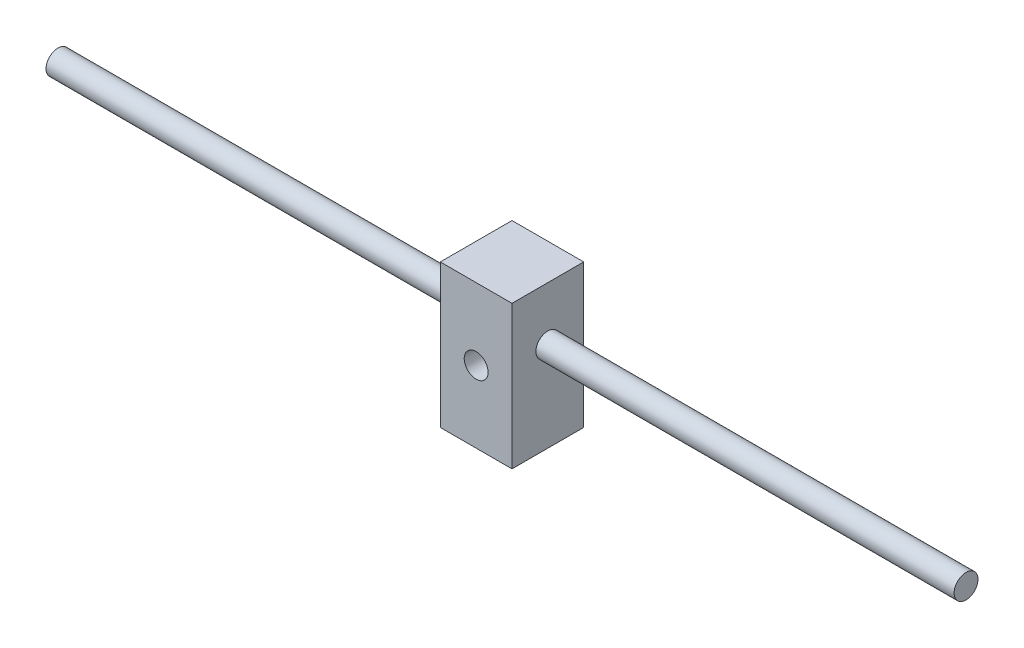
ISO-10303-21;
HEADER;
FILE_DESCRIPTION(('STEP AP214'),'2;1');
FILE_NAME('part.step','',(''),(''),'','','');
FILE_SCHEMA(('AUTOMOTIVE_DESIGN { 1 0 10303 214 1 1 1 1 }'));
ENDSEC;
DATA;
#1=APPLICATION_CONTEXT('core data for automotive mechanical design processes');
#2=APPLICATION_PROTOCOL_DEFINITION('international standard','automotive_design',2000,#1);
#3=PRODUCT_CONTEXT('',#1,'mechanical');
#4=PRODUCT('Part','Part','',(#3));
#5=PRODUCT_RELATED_PRODUCT_CATEGORY('part','',(#4));
#6=PRODUCT_DEFINITION_FORMATION('','',#4);
#7=PRODUCT_DEFINITION_CONTEXT('part definition',#1,'design');
#8=PRODUCT_DEFINITION('design','',#6,#7);
#9=PRODUCT_DEFINITION_SHAPE('','',#8);
#10=(LENGTH_UNIT() NAMED_UNIT(*) SI_UNIT(.MILLI.,.METRE.));
#11=(NAMED_UNIT(*) PLANE_ANGLE_UNIT() SI_UNIT($,.RADIAN.));
#12=(NAMED_UNIT(*) SI_UNIT($,.STERADIAN.) SOLID_ANGLE_UNIT());
#13=UNCERTAINTY_MEASURE_WITH_UNIT(LENGTH_MEASURE(1.E-05),#10,'distance_accuracy_value','');
#14=(GEOMETRIC_REPRESENTATION_CONTEXT(3) GLOBAL_UNCERTAINTY_ASSIGNED_CONTEXT((#13)) GLOBAL_UNIT_ASSIGNED_CONTEXT((#10,
#11,#12)) REPRESENTATION_CONTEXT('',''));
#15=CARTESIAN_POINT('',(0.,0.,0.));
#16=DIRECTION('',(0.,0.,1.));
#17=DIRECTION('',(1.,0.,0.));
#18=AXIS2_PLACEMENT_3D('',#15,#16,#17);
#19=CARTESIAN_POINT('',(0.,0.,30.));
#20=DIRECTION('',(0.,0.,1.));
#21=DIRECTION('',(1.,0.,0.));
#22=AXIS2_PLACEMENT_3D('',#19,#20,#21);
#23=PLANE('',#22);
#24=DIRECTION('',(0.,-1.,0.));
#25=VECTOR('',#24,1.);
#26=CARTESIAN_POINT('',(-30.,60.,30.));
#27=LINE('',#26,#25);
#28=CARTESIAN_POINT('',(-30.,60.,30.));
#29=VERTEX_POINT('',#28);
#30=CARTESIAN_POINT('',(-30.,-60.,30.));
#31=VERTEX_POINT('',#30);
#32=EDGE_CURVE('E95',#29,#31,#27,.T.);
#33=ORIENTED_EDGE('',*,*,#32,.T.);
#34=DIRECTION('',(1.,0.,0.));
#35=VECTOR('',#34,1.);
#36=CARTESIAN_POINT('',(-30.,-60.,30.));
#37=LINE('',#36,#35);
#38=CARTESIAN_POINT('',(30.,-60.,30.));
#39=VERTEX_POINT('',#38);
#40=EDGE_CURVE('E90',#31,#39,#37,.T.);
#41=ORIENTED_EDGE('',*,*,#40,.T.);
#42=DIRECTION('',(0.,1.,0.));
#43=VECTOR('',#42,1.);
#44=CARTESIAN_POINT('',(30.,60.,30.));
#45=LINE('',#44,#43);
#46=CARTESIAN_POINT('',(30.,60.,30.));
#47=VERTEX_POINT('',#46);
#48=EDGE_CURVE('E93',#39,#47,#45,.T.);
#49=ORIENTED_EDGE('',*,*,#48,.T.);
#50=DIRECTION('',(-1.,0.,0.));
#51=VECTOR('',#50,1.);
#52=CARTESIAN_POINT('',(-30.,60.,30.));
#53=LINE('',#52,#51);
#54=EDGE_CURVE('E59',#47,#29,#53,.T.);
#55=ORIENTED_EDGE('',*,*,#54,.T.);
#56=EDGE_LOOP('',(#33,#41,#49,#55));
#57=FACE_BOUND('',#56,.T.);
#58=CARTESIAN_POINT('',(0.,0.,30.));
#59=DIRECTION('',(0.,0.,1.));
#60=DIRECTION('',(1.,0.,0.));
#61=AXIS2_PLACEMENT_3D('',#58,#59,#60);
#62=CIRCLE('',#61,10.);
#63=CARTESIAN_POINT('',(-10.,0.,30.));
#64=VERTEX_POINT('',#63);
#65=EDGE_CURVE('E116',#64,#64,#62,.T.);
#66=ORIENTED_EDGE('',*,*,#65,.F.);
#67=EDGE_LOOP('',(#66));
#68=FACE_BOUND('',#67,.T.);
#69=ADVANCED_FACE('F39',(#57,#68),#23,.T.);
#70=CARTESIAN_POINT('',(0.,0.,-30.));
#71=DIRECTION('',(0.,0.,1.));
#72=DIRECTION('',(1.,0.,0.));
#73=AXIS2_PLACEMENT_3D('',#70,#71,#72);
#74=PLANE('',#73);
#75=DIRECTION('',(0.,-1.,0.));
#76=VECTOR('',#75,1.);
#77=CARTESIAN_POINT('',(-30.,60.,-30.));
#78=LINE('',#77,#76);
#79=CARTESIAN_POINT('',(-30.,60.,-30.));
#80=VERTEX_POINT('',#79);
#81=CARTESIAN_POINT('',(-30.,-60.,-30.));
#82=VERTEX_POINT('',#81);
#83=EDGE_CURVE('E112',#80,#82,#78,.T.);
#84=ORIENTED_EDGE('',*,*,#83,.F.);
#85=DIRECTION('',(-1.,0.,0.));
#86=VECTOR('',#85,1.);
#87=CARTESIAN_POINT('',(-30.,60.,-30.));
#88=LINE('',#87,#86);
#89=CARTESIAN_POINT('',(30.,60.,-30.));
#90=VERTEX_POINT('',#89);
#91=EDGE_CURVE('E82',#90,#80,#88,.T.);
#92=ORIENTED_EDGE('',*,*,#91,.F.);
#93=DIRECTION('',(0.,1.,0.));
#94=VECTOR('',#93,1.);
#95=CARTESIAN_POINT('',(30.,60.,-30.));
#96=LINE('',#95,#94);
#97=CARTESIAN_POINT('',(30.,-60.,-30.));
#98=VERTEX_POINT('',#97);
#99=EDGE_CURVE('E76',#98,#90,#96,.T.);
#100=ORIENTED_EDGE('',*,*,#99,.F.);
#101=DIRECTION('',(1.,0.,0.));
#102=VECTOR('',#101,1.);
#103=CARTESIAN_POINT('',(-30.,-60.,-30.));
#104=LINE('',#103,#102);
#105=EDGE_CURVE('E101',#82,#98,#104,.T.);
#106=ORIENTED_EDGE('',*,*,#105,.F.);
#107=EDGE_LOOP('',(#84,#92,#100,#106));
#108=FACE_BOUND('',#107,.T.);
#109=CARTESIAN_POINT('',(0.,0.,-30.));
#110=DIRECTION('',(0.,0.,1.));
#111=DIRECTION('',(1.,0.,0.));
#112=AXIS2_PLACEMENT_3D('',#109,#110,#111);
#113=CIRCLE('',#112,10.);
#114=CARTESIAN_POINT('',(-10.,0.,-30.));
#115=VERTEX_POINT('',#114);
#116=EDGE_CURVE('E134',#115,#115,#113,.T.);
#117=ORIENTED_EDGE('',*,*,#116,.T.);
#118=EDGE_LOOP('',(#117));
#119=FACE_BOUND('',#118,.T.);
#120=ADVANCED_FACE('F129',(#108,#119),#74,.F.);
#121=CARTESIAN_POINT('',(-30.,60.,30.));
#122=DIRECTION('',(1.,0.,0.));
#123=DIRECTION('',(0.,0.,-1.));
#124=AXIS2_PLACEMENT_3D('',#121,#122,#123);
#125=PLANE('',#124);
#126=CARTESIAN_POINT('',(-30.,15.,0.));
#127=DIRECTION('',(-1.,0.,0.));
#128=DIRECTION('',(0.,-1.,0.));
#129=AXIS2_PLACEMENT_3D('',#126,#127,#128);
#130=CIRCLE('',#129,10.);
#131=CARTESIAN_POINT('',(-30.,5.,0.));
#132=VERTEX_POINT('',#131);
#133=EDGE_CURVE('E50',#132,#132,#130,.T.);
#134=ORIENTED_EDGE('',*,*,#133,.F.);
#135=EDGE_LOOP('',(#134));
#136=FACE_BOUND('',#135,.T.);
#137=ORIENTED_EDGE('',*,*,#83,.T.);
#138=DIRECTION('',(0.,0.,-1.));
#139=VECTOR('',#138,1.);
#140=CARTESIAN_POINT('',(-30.,-60.,30.));
#141=LINE('',#140,#139);
#142=EDGE_CURVE('E43',#31,#82,#141,.T.);
#143=ORIENTED_EDGE('',*,*,#142,.F.);
#144=ORIENTED_EDGE('',*,*,#32,.F.);
#145=DIRECTION('',(0.,0.,-1.));
#146=VECTOR('',#145,1.);
#147=CARTESIAN_POINT('',(-30.,60.,30.));
#148=LINE('',#147,#146);
#149=EDGE_CURVE('E108',#29,#80,#148,.T.);
#150=ORIENTED_EDGE('',*,*,#149,.T.);
#151=EDGE_LOOP('',(#137,#143,#144,#150));
#152=FACE_BOUND('',#151,.T.);
#153=ADVANCED_FACE('F41',(#136,#152),#125,.F.);
#154=CARTESIAN_POINT('',(-30.,-60.,30.));
#155=DIRECTION('',(0.,1.,0.));
#156=DIRECTION('',(0.,0.,1.));
#157=AXIS2_PLACEMENT_3D('',#154,#155,#156);
#158=PLANE('',#157);
#159=ORIENTED_EDGE('',*,*,#105,.T.);
#160=DIRECTION('',(0.,0.,-1.));
#161=VECTOR('',#160,1.);
#162=CARTESIAN_POINT('',(30.,-60.,30.));
#163=LINE('',#162,#161);
#164=EDGE_CURVE('E99',#39,#98,#163,.T.);
#165=ORIENTED_EDGE('',*,*,#164,.F.);
#166=ORIENTED_EDGE('',*,*,#40,.F.);
#167=ORIENTED_EDGE('',*,*,#142,.T.);
#168=EDGE_LOOP('',(#159,#165,#166,#167));
#169=FACE_BOUND('',#168,.T.);
#170=ADVANCED_FACE('F100',(#169),#158,.F.);
#171=CARTESIAN_POINT('',(30.,60.,30.));
#172=DIRECTION('',(-1.,0.,0.));
#173=DIRECTION('',(0.,0.,1.));
#174=AXIS2_PLACEMENT_3D('',#171,#172,#173);
#175=PLANE('',#174);
#176=CARTESIAN_POINT('',(30.,15.,0.));
#177=DIRECTION('',(1.,0.,0.));
#178=DIRECTION('',(0.,0.,-1.));
#179=AXIS2_PLACEMENT_3D('',#176,#177,#178);
#180=CIRCLE('',#179,10.);
#181=CARTESIAN_POINT('',(30.,15.,-10.));
#182=VERTEX_POINT('',#181);
#183=EDGE_CURVE('E11',#182,#182,#180,.T.);
#184=ORIENTED_EDGE('',*,*,#183,.F.);
#185=EDGE_LOOP('',(#184));
#186=FACE_BOUND('',#185,.T.);
#187=ORIENTED_EDGE('',*,*,#99,.T.);
#188=DIRECTION('',(0.,0.,-1.));
#189=VECTOR('',#188,1.);
#190=CARTESIAN_POINT('',(30.,60.,30.));
#191=LINE('',#190,#189);
#192=EDGE_CURVE('E103',#47,#90,#191,.T.);
#193=ORIENTED_EDGE('',*,*,#192,.F.);
#194=ORIENTED_EDGE('',*,*,#48,.F.);
#195=ORIENTED_EDGE('',*,*,#164,.T.);
#196=EDGE_LOOP('',(#187,#193,#194,#195));
#197=FACE_BOUND('',#196,.T.);
#198=ADVANCED_FACE('F104',(#186,#197),#175,.F.);
#199=CARTESIAN_POINT('',(-30.,60.,30.));
#200=DIRECTION('',(0.,-1.,0.));
#201=DIRECTION('',(0.,0.,-1.));
#202=AXIS2_PLACEMENT_3D('',#199,#200,#201);
#203=PLANE('',#202);
#204=ORIENTED_EDGE('',*,*,#91,.T.);
#205=ORIENTED_EDGE('',*,*,#149,.F.);
#206=ORIENTED_EDGE('',*,*,#54,.F.);
#207=ORIENTED_EDGE('',*,*,#192,.T.);
#208=EDGE_LOOP('',(#204,#205,#206,#207));
#209=FACE_BOUND('',#208,.T.);
#210=ADVANCED_FACE('F126',(#209),#203,.F.);
#211=CARTESIAN_POINT('',(0.,0.,30.));
#212=DIRECTION('',(0.,0.,-1.));
#213=DIRECTION('',(-1.,0.,0.));
#214=AXIS2_PLACEMENT_3D('',#211,#212,#213);
#215=CYLINDRICAL_SURFACE('',#214,10.);
#216=CARTESIAN_POINT('',(-10.,0.,30.));
#217=CARTESIAN_POINT('',(-10.,0.,29.375));
#218=CARTESIAN_POINT('',(-10.,0.,28.75));
#219=CARTESIAN_POINT('',(-10.,0.,27.5));
#220=CARTESIAN_POINT('',(-10.,0.,26.875));
#221=CARTESIAN_POINT('',(-10.,0.,25.625));
#222=CARTESIAN_POINT('',(-10.,0.,25.));
#223=CARTESIAN_POINT('',(-10.,0.,23.75));
#224=CARTESIAN_POINT('',(-10.,0.,23.125));
#225=CARTESIAN_POINT('',(-10.,0.,21.875));
#226=CARTESIAN_POINT('',(-10.,0.,21.25));
#227=CARTESIAN_POINT('',(-10.,0.,20.));
#228=CARTESIAN_POINT('',(-10.,0.,19.375));
#229=CARTESIAN_POINT('',(-10.,0.,18.125));
#230=CARTESIAN_POINT('',(-10.,0.,17.5));
#231=CARTESIAN_POINT('',(-10.,0.,16.25));
#232=CARTESIAN_POINT('',(-10.,0.,15.625));
#233=CARTESIAN_POINT('',(-10.,0.,14.375));
#234=CARTESIAN_POINT('',(-10.,0.,13.75));
#235=CARTESIAN_POINT('',(-10.,0.,12.5));
#236=CARTESIAN_POINT('',(-10.,0.,11.875));
#237=CARTESIAN_POINT('',(-10.,0.,10.625));
#238=CARTESIAN_POINT('',(-10.,0.,10.));
#239=CARTESIAN_POINT('',(-10.,0.,8.75));
#240=CARTESIAN_POINT('',(-10.,0.,8.125));
#241=CARTESIAN_POINT('',(-10.,0.,6.875));
#242=CARTESIAN_POINT('',(-10.,0.,6.25));
#243=CARTESIAN_POINT('',(-10.,0.,5.));
#244=CARTESIAN_POINT('',(-10.,0.,4.375));
#245=CARTESIAN_POINT('',(-10.,0.,3.125));
#246=CARTESIAN_POINT('',(-10.,0.,2.5));
#247=CARTESIAN_POINT('',(-10.,0.,1.25));
#248=CARTESIAN_POINT('',(-10.,0.,0.625));
#249=CARTESIAN_POINT('',(-10.,0.,-0.624999999999999));
#250=CARTESIAN_POINT('',(-10.,0.,-1.25));
#251=CARTESIAN_POINT('',(-10.,0.,-2.5));
#252=CARTESIAN_POINT('',(-10.,0.,-3.125));
#253=CARTESIAN_POINT('',(-10.,0.,-4.375));
#254=CARTESIAN_POINT('',(-10.,0.,-5.));
#255=CARTESIAN_POINT('',(-10.,0.,-6.25));
#256=CARTESIAN_POINT('',(-10.,0.,-6.875));
#257=CARTESIAN_POINT('',(-10.,0.,-8.125));
#258=CARTESIAN_POINT('',(-10.,0.,-8.75));
#259=CARTESIAN_POINT('',(-10.,0.,-10.));
#260=CARTESIAN_POINT('',(-10.,0.,-10.625));
#261=CARTESIAN_POINT('',(-10.,0.,-11.875));
#262=CARTESIAN_POINT('',(-10.,0.,-12.5));
#263=CARTESIAN_POINT('',(-10.,0.,-13.75));
#264=CARTESIAN_POINT('',(-10.,0.,-14.375));
#265=CARTESIAN_POINT('',(-10.,0.,-15.625));
#266=CARTESIAN_POINT('',(-10.,0.,-16.25));
#267=CARTESIAN_POINT('',(-10.,0.,-17.5));
#268=CARTESIAN_POINT('',(-10.,0.,-18.125));
#269=CARTESIAN_POINT('',(-10.,0.,-19.375));
#270=CARTESIAN_POINT('',(-10.,0.,-20.));
#271=CARTESIAN_POINT('',(-10.,0.,-21.25));
#272=CARTESIAN_POINT('',(-10.,0.,-21.875));
#273=CARTESIAN_POINT('',(-10.,0.,-23.125));
#274=CARTESIAN_POINT('',(-10.,0.,-23.75));
#275=CARTESIAN_POINT('',(-10.,0.,-25.));
#276=CARTESIAN_POINT('',(-10.,0.,-25.625));
#277=CARTESIAN_POINT('',(-10.,0.,-26.875));
#278=CARTESIAN_POINT('',(-10.,0.,-27.5));
#279=CARTESIAN_POINT('',(-10.,0.,-28.75));
#280=CARTESIAN_POINT('',(-10.,0.,-29.375));
#281=CARTESIAN_POINT('',(-10.,0.,-30.));
#282=B_SPLINE_CURVE_WITH_KNOTS('',3,(#216,#217,#218,#219,#220,#221,#222,#223,#224,#225,#226,
#227,#228,#229,#230,#231,#232,#233,#234,#235,#236,#237,#238,#239,#240,#241,#242,#243,#244,#245,
#246,#247,#248,#249,#250,#251,#252,#253,#254,#255,#256,#257,#258,#259,#260,#261,#262,#263,#264,
#265,#266,#267,#268,#269,#270,#271,#272,#273,#274,#275,#276,#277,#278,#279,#280,#281),
.UNSPECIFIED.,.F.,.F.,(4,2,2,2,2,2,2,2,2,2,2,2,2,2,2,2,2,2,2,2,2,2,2,2,2,2,2,2,2,2,2,2,4),(0.,
1.875,3.75,5.625,7.5,9.375,11.25,13.125,15.,16.875,18.75,20.625,22.5,24.375,26.25,28.125,30.,
31.875,33.75,35.625,37.5,39.375,41.25,43.125,45.,46.875,48.75,50.625,52.5,54.375,56.25,58.125,
60.),.UNSPECIFIED.);
#283=EDGE_CURVE('BSEAM168',#64,#115,#282,.T.);
#284=ORIENTED_EDGE('',*,*,#65,.T.);
#285=ORIENTED_EDGE('',*,*,#116,.F.);
#286=ORIENTED_EDGE('',*,*,#283,.T.);
#287=ORIENTED_EDGE('',*,*,#283,.F.);
#288=EDGE_LOOP('',(#284,#286,#285,#287));
#289=FACE_BOUND('',#288,.T.);
#290=ADVANCED_FACE('F168',(#289),#215,.F.);
#291=CARTESIAN_POINT('',(-380.,15.,0.));
#292=DIRECTION('',(1.,0.,0.));
#293=DIRECTION('',(0.,1.,0.));
#294=AXIS2_PLACEMENT_3D('',#291,#292,#293);
#295=CYLINDRICAL_SURFACE('',#294,10.);
#296=CARTESIAN_POINT('',(-380.,15.,0.));
#297=DIRECTION('',(-1.,0.,0.));
#298=DIRECTION('',(0.,-1.,0.));
#299=AXIS2_PLACEMENT_3D('',#296,#297,#298);
#300=CIRCLE('',#299,10.);
#301=CARTESIAN_POINT('',(-380.,4.99999999999996,0.));
#302=VERTEX_POINT('',#301);
#303=EDGE_CURVE('E138',#302,#302,#300,.T.);
#304=ORIENTED_EDGE('',*,*,#303,.F.);
#305=EDGE_LOOP('',(#304));
#306=FACE_BOUND('',#305,.T.);
#307=ORIENTED_EDGE('',*,*,#133,.T.);
#308=EDGE_LOOP('',(#307));
#309=FACE_BOUND('',#308,.T.);
#310=ADVANCED_FACE('F179',(#306,#309),#295,.T.);
#311=CARTESIAN_POINT('',(-380.,15.,0.));
#312=DIRECTION('',(-1.,0.,0.));
#313=DIRECTION('',(0.,-1.,0.));
#314=AXIS2_PLACEMENT_3D('',#311,#312,#313);
#315=PLANE('',#314);
#316=ORIENTED_EDGE('',*,*,#303,.T.);
#317=EDGE_LOOP('',(#316));
#318=FACE_BOUND('',#317,.T.);
#319=ADVANCED_FACE('F158',(#318),#315,.T.);
#320=CARTESIAN_POINT('',(380.,15.,0.));
#321=DIRECTION('',(-1.,0.,0.));
#322=DIRECTION('',(0.,0.,1.));
#323=AXIS2_PLACEMENT_3D('',#320,#321,#322);
#324=CYLINDRICAL_SURFACE('',#323,10.);
#325=CARTESIAN_POINT('',(380.,15.,0.));
#326=DIRECTION('',(1.,0.,0.));
#327=DIRECTION('',(0.,0.,-1.));
#328=AXIS2_PLACEMENT_3D('',#325,#326,#327);
#329=CIRCLE('',#328,10.);
#330=CARTESIAN_POINT('',(380.,15.,-10.));
#331=VERTEX_POINT('',#330);
#332=EDGE_CURVE('E147',#331,#331,#329,.T.);
#333=ORIENTED_EDGE('',*,*,#332,.F.);
#334=EDGE_LOOP('',(#333));
#335=FACE_BOUND('',#334,.T.);
#336=ORIENTED_EDGE('',*,*,#183,.T.);
#337=EDGE_LOOP('',(#336));
#338=FACE_BOUND('',#337,.T.);
#339=ADVANCED_FACE('F155',(#335,#338),#324,.T.);
#340=CARTESIAN_POINT('',(380.,15.,0.));
#341=DIRECTION('',(1.,0.,0.));
#342=DIRECTION('',(0.,0.,-1.));
#343=AXIS2_PLACEMENT_3D('',#340,#341,#342);
#344=PLANE('',#343);
#345=ORIENTED_EDGE('',*,*,#332,.T.);
#346=EDGE_LOOP('',(#345));
#347=FACE_BOUND('',#346,.T.);
#348=ADVANCED_FACE('F153',(#347),#344,.T.);
#349=CLOSED_SHELL('',(#69,#120,#153,#170,#198,#210,#290,#310,#319,#339,#348));
#350=MANIFOLD_SOLID_BREP('B2',#349);
#351=ADVANCED_BREP_SHAPE_REPRESENTATION('',(#18,#350),#14);
#352=SHAPE_DEFINITION_REPRESENTATION(#9,#351);
ENDSEC;
END-ISO-10303-21;
